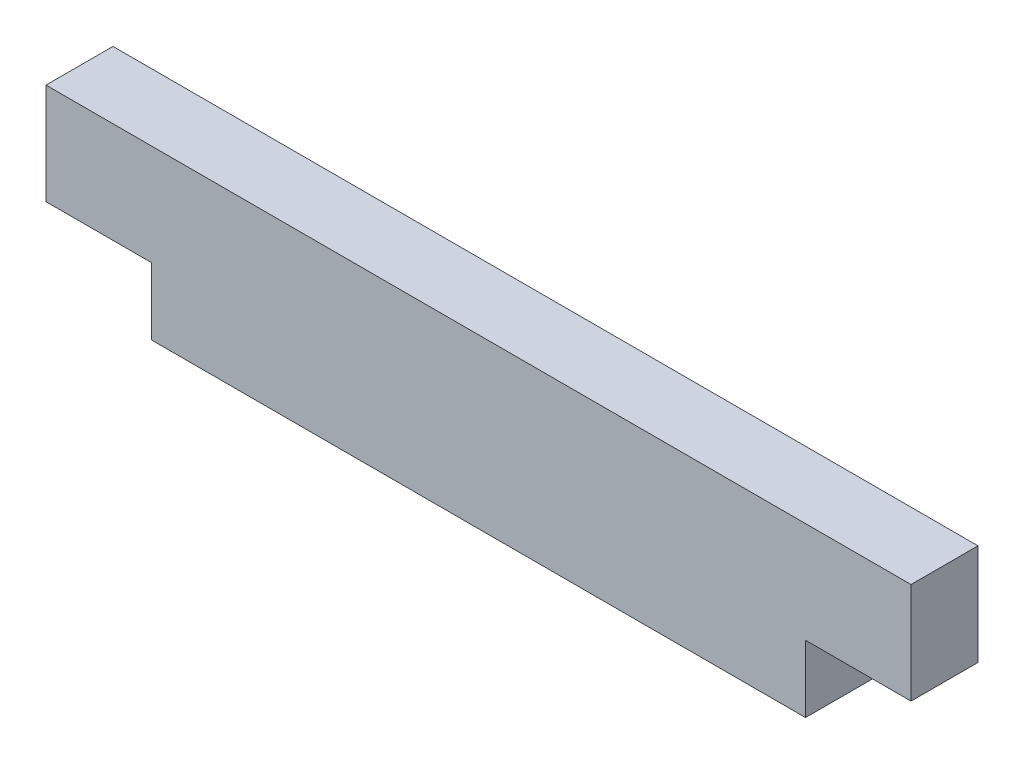
ISO-10303-21;
HEADER;
FILE_DESCRIPTION(('STEP AP214'),'2;1');
FILE_NAME('part.step','',(''),(''),'','','');
FILE_SCHEMA(('AUTOMOTIVE_DESIGN { 1 0 10303 214 1 1 1 1 }'));
ENDSEC;
DATA;
#1=APPLICATION_CONTEXT('core data for automotive mechanical design processes');
#2=APPLICATION_PROTOCOL_DEFINITION('international standard','automotive_design',2000,#1);
#3=PRODUCT_CONTEXT('',#1,'mechanical');
#4=PRODUCT('Part','Part','',(#3));
#5=PRODUCT_RELATED_PRODUCT_CATEGORY('part','',(#4));
#6=PRODUCT_DEFINITION_FORMATION('','',#4);
#7=PRODUCT_DEFINITION_CONTEXT('part definition',#1,'design');
#8=PRODUCT_DEFINITION('design','',#6,#7);
#9=PRODUCT_DEFINITION_SHAPE('','',#8);
#10=(LENGTH_UNIT() NAMED_UNIT(*) SI_UNIT(.MILLI.,.METRE.));
#11=(NAMED_UNIT(*) PLANE_ANGLE_UNIT() SI_UNIT($,.RADIAN.));
#12=(NAMED_UNIT(*) SI_UNIT($,.STERADIAN.) SOLID_ANGLE_UNIT());
#13=UNCERTAINTY_MEASURE_WITH_UNIT(LENGTH_MEASURE(1.E-05),#10,'distance_accuracy_value','');
#14=(GEOMETRIC_REPRESENTATION_CONTEXT(3) GLOBAL_UNCERTAINTY_ASSIGNED_CONTEXT((#13)) GLOBAL_UNIT_ASSIGNED_CONTEXT((#10,
#11,#12)) REPRESENTATION_CONTEXT('',''));
#15=CARTESIAN_POINT('',(0.,0.,0.));
#16=DIRECTION('',(0.,0.,1.));
#17=DIRECTION('',(1.,0.,0.));
#18=AXIS2_PLACEMENT_3D('',#15,#16,#17);
#19=CARTESIAN_POINT('',(0.,-2.394,3.175));
#20=DIRECTION('',(0.,1.,0.));
#21=DIRECTION('',(0.,0.,1.));
#22=AXIS2_PLACEMENT_3D('',#19,#20,#21);
#23=PLANE('',#22);
#24=DIRECTION('',(1.,0.,0.));
#25=VECTOR('',#24,1.);
#26=CARTESIAN_POINT('',(0.,-2.394,0.));
#27=LINE('',#26,#25);
#28=CARTESIAN_POINT('',(-20.5,-2.394,0.));
#29=VERTEX_POINT('',#28);
#30=CARTESIAN_POINT('',(-15.5,-2.394,0.));
#31=VERTEX_POINT('',#30);
#32=EDGE_CURVE('E149',#29,#31,#27,.T.);
#33=ORIENTED_EDGE('',*,*,#32,.T.);
#34=DIRECTION('',(0.,0.,-1.));
#35=VECTOR('',#34,1.);
#36=CARTESIAN_POINT('',(-15.5,-2.394,3.175));
#37=LINE('',#36,#35);
#38=CARTESIAN_POINT('',(-15.5,-2.394,3.175));
#39=VERTEX_POINT('',#38);
#40=EDGE_CURVE('E11',#39,#31,#37,.T.);
#41=ORIENTED_EDGE('',*,*,#40,.F.);
#42=DIRECTION('',(1.,0.,0.));
#43=VECTOR('',#42,1.);
#44=CARTESIAN_POINT('',(0.,-2.394,3.175));
#45=LINE('',#44,#43);
#46=CARTESIAN_POINT('',(-20.5,-2.394,3.175));
#47=VERTEX_POINT('',#46);
#48=EDGE_CURVE('E174',#47,#39,#45,.T.);
#49=ORIENTED_EDGE('',*,*,#48,.F.);
#50=DIRECTION('',(0.,0.,-1.));
#51=VECTOR('',#50,1.);
#52=CARTESIAN_POINT('',(-20.5,-2.394,3.175));
#53=LINE('',#52,#51);
#54=EDGE_CURVE('E63',#47,#29,#53,.T.);
#55=ORIENTED_EDGE('',*,*,#54,.T.);
#56=EDGE_LOOP('',(#33,#41,#49,#55));
#57=FACE_BOUND('',#56,.T.);
#58=ADVANCED_FACE('F45',(#57),#23,.F.);
#59=CARTESIAN_POINT('',(-15.5,0.,3.175));
#60=DIRECTION('',(1.,0.,0.));
#61=DIRECTION('',(0.,0.,-1.));
#62=AXIS2_PLACEMENT_3D('',#59,#60,#61);
#63=PLANE('',#62);
#64=DIRECTION('',(0.,-1.,0.));
#65=VECTOR('',#64,1.);
#66=CARTESIAN_POINT('',(-15.5,0.,0.));
#67=LINE('',#66,#65);
#68=CARTESIAN_POINT('',(-15.5,-5.569,0.));
#69=VERTEX_POINT('',#68);
#70=EDGE_CURVE('E152',#31,#69,#67,.T.);
#71=ORIENTED_EDGE('',*,*,#70,.T.);
#72=DIRECTION('',(0.,0.,-1.));
#73=VECTOR('',#72,1.);
#74=CARTESIAN_POINT('',(-15.5,-5.569,3.175));
#75=LINE('',#74,#73);
#76=CARTESIAN_POINT('',(-15.5,-5.569,3.175));
#77=VERTEX_POINT('',#76);
#78=EDGE_CURVE('E55',#77,#69,#75,.T.);
#79=ORIENTED_EDGE('',*,*,#78,.F.);
#80=DIRECTION('',(0.,-1.,0.));
#81=VECTOR('',#80,1.);
#82=CARTESIAN_POINT('',(-15.5,0.,3.175));
#83=LINE('',#82,#81);
#84=EDGE_CURVE('E101',#39,#77,#83,.T.);
#85=ORIENTED_EDGE('',*,*,#84,.F.);
#86=ORIENTED_EDGE('',*,*,#40,.T.);
#87=EDGE_LOOP('',(#71,#79,#85,#86));
#88=FACE_BOUND('',#87,.T.);
#89=ADVANCED_FACE('F47',(#88),#63,.F.);
#90=CARTESIAN_POINT('',(0.,-5.569,3.175));
#91=DIRECTION('',(0.,1.,0.));
#92=DIRECTION('',(0.,0.,1.));
#93=AXIS2_PLACEMENT_3D('',#90,#91,#92);
#94=PLANE('',#93);
#95=DIRECTION('',(1.,0.,0.));
#96=VECTOR('',#95,1.);
#97=CARTESIAN_POINT('',(0.,-5.569,0.));
#98=LINE('',#97,#96);
#99=CARTESIAN_POINT('',(15.5,-5.569,0.));
#100=VERTEX_POINT('',#99);
#101=EDGE_CURVE('E157',#69,#100,#98,.T.);
#102=ORIENTED_EDGE('',*,*,#101,.T.);
#103=DIRECTION('',(0.,0.,-1.));
#104=VECTOR('',#103,1.);
#105=CARTESIAN_POINT('',(15.5,-5.569,3.175));
#106=LINE('',#105,#104);
#107=CARTESIAN_POINT('',(15.5,-5.569,3.175));
#108=VERTEX_POINT('',#107);
#109=EDGE_CURVE('E184',#108,#100,#106,.T.);
#110=ORIENTED_EDGE('',*,*,#109,.F.);
#111=DIRECTION('',(1.,0.,0.));
#112=VECTOR('',#111,1.);
#113=CARTESIAN_POINT('',(0.,-5.569,3.175));
#114=LINE('',#113,#112);
#115=EDGE_CURVE('E192',#77,#108,#114,.T.);
#116=ORIENTED_EDGE('',*,*,#115,.F.);
#117=ORIENTED_EDGE('',*,*,#78,.T.);
#118=EDGE_LOOP('',(#102,#110,#116,#117));
#119=FACE_BOUND('',#118,.T.);
#120=ADVANCED_FACE('F190',(#119),#94,.F.);
#121=CARTESIAN_POINT('',(15.5,0.,3.175));
#122=DIRECTION('',(1.,0.,0.));
#123=DIRECTION('',(0.,0.,-1.));
#124=AXIS2_PLACEMENT_3D('',#121,#122,#123);
#125=PLANE('',#124);
#126=DIRECTION('',(0.,-1.,0.));
#127=VECTOR('',#126,1.);
#128=CARTESIAN_POINT('',(15.5,0.,0.));
#129=LINE('',#128,#127);
#130=CARTESIAN_POINT('',(15.5,-2.394,0.));
#131=VERTEX_POINT('',#130);
#132=EDGE_CURVE('E161',#131,#100,#129,.T.);
#133=ORIENTED_EDGE('',*,*,#132,.F.);
#134=DIRECTION('',(0.,0.,-1.));
#135=VECTOR('',#134,1.);
#136=CARTESIAN_POINT('',(15.5,-2.394,3.175));
#137=LINE('',#136,#135);
#138=CARTESIAN_POINT('',(15.5,-2.394,3.175));
#139=VERTEX_POINT('',#138);
#140=EDGE_CURVE('E181',#139,#131,#137,.T.);
#141=ORIENTED_EDGE('',*,*,#140,.F.);
#142=DIRECTION('',(0.,-1.,0.));
#143=VECTOR('',#142,1.);
#144=CARTESIAN_POINT('',(15.5,0.,3.175));
#145=LINE('',#144,#143);
#146=EDGE_CURVE('E201',#139,#108,#145,.T.);
#147=ORIENTED_EDGE('',*,*,#146,.T.);
#148=ORIENTED_EDGE('',*,*,#109,.T.);
#149=EDGE_LOOP('',(#133,#141,#147,#148));
#150=FACE_BOUND('',#149,.T.);
#151=ADVANCED_FACE('F199',(#150),#125,.T.);
#152=CARTESIAN_POINT('',(20.5,-2.394,0.));
#153=VERTEX_POINT('',#152);
#154=EDGE_CURVE('E153',#131,#153,#27,.T.);
#155=ORIENTED_EDGE('',*,*,#154,.T.);
#156=DIRECTION('',(0.,0.,-1.));
#157=VECTOR('',#156,1.);
#158=CARTESIAN_POINT('',(20.5,-2.394,3.175));
#159=LINE('',#158,#157);
#160=CARTESIAN_POINT('',(20.5,-2.394,3.175));
#161=VERTEX_POINT('',#160);
#162=EDGE_CURVE('E139',#161,#153,#159,.T.);
#163=ORIENTED_EDGE('',*,*,#162,.F.);
#164=EDGE_CURVE('E125',#139,#161,#45,.T.);
#165=ORIENTED_EDGE('',*,*,#164,.F.);
#166=ORIENTED_EDGE('',*,*,#140,.T.);
#167=EDGE_LOOP('',(#155,#163,#165,#166));
#168=FACE_BOUND('',#167,.T.);
#169=ADVANCED_FACE('F212',(#168),#23,.F.);
#170=CARTESIAN_POINT('',(20.5,0.,3.175));
#171=DIRECTION('',(-1.,0.,0.));
#172=DIRECTION('',(0.,0.,1.));
#173=AXIS2_PLACEMENT_3D('',#170,#171,#172);
#174=PLANE('',#173);
#175=DIRECTION('',(0.,1.,0.));
#176=VECTOR('',#175,1.);
#177=CARTESIAN_POINT('',(20.5,0.,0.));
#178=LINE('',#177,#176);
#179=CARTESIAN_POINT('',(20.5,2.394,0.));
#180=VERTEX_POINT('',#179);
#181=EDGE_CURVE('E135',#153,#180,#178,.T.);
#182=ORIENTED_EDGE('',*,*,#181,.T.);
#183=DIRECTION('',(0.,0.,-1.));
#184=VECTOR('',#183,1.);
#185=CARTESIAN_POINT('',(20.5,2.394,3.175));
#186=LINE('',#185,#184);
#187=CARTESIAN_POINT('',(20.5,2.394,3.175));
#188=VERTEX_POINT('',#187);
#189=EDGE_CURVE('E132',#188,#180,#186,.T.);
#190=ORIENTED_EDGE('',*,*,#189,.F.);
#191=DIRECTION('',(0.,1.,0.));
#192=VECTOR('',#191,1.);
#193=CARTESIAN_POINT('',(20.5,0.,3.175));
#194=LINE('',#193,#192);
#195=EDGE_CURVE('E117',#161,#188,#194,.T.);
#196=ORIENTED_EDGE('',*,*,#195,.F.);
#197=ORIENTED_EDGE('',*,*,#162,.T.);
#198=EDGE_LOOP('',(#182,#190,#196,#197));
#199=FACE_BOUND('',#198,.T.);
#200=ADVANCED_FACE('F133',(#199),#174,.F.);
#201=CARTESIAN_POINT('',(0.,2.394,3.175));
#202=DIRECTION('',(0.,1.,0.));
#203=DIRECTION('',(0.,0.,1.));
#204=AXIS2_PLACEMENT_3D('',#201,#202,#203);
#205=PLANE('',#204);
#206=DIRECTION('',(1.,0.,0.));
#207=VECTOR('',#206,1.);
#208=CARTESIAN_POINT('',(0.,2.394,0.));
#209=LINE('',#208,#207);
#210=CARTESIAN_POINT('',(-20.5,2.394,0.));
#211=VERTEX_POINT('',#210);
#212=EDGE_CURVE('E167',#211,#180,#209,.T.);
#213=ORIENTED_EDGE('',*,*,#212,.F.);
#214=DIRECTION('',(0.,0.,-1.));
#215=VECTOR('',#214,1.);
#216=CARTESIAN_POINT('',(-20.5,2.394,3.175));
#217=LINE('',#216,#215);
#218=CARTESIAN_POINT('',(-20.5,2.394,3.175));
#219=VERTEX_POINT('',#218);
#220=EDGE_CURVE('E89',#219,#211,#217,.T.);
#221=ORIENTED_EDGE('',*,*,#220,.F.);
#222=DIRECTION('',(1.,0.,0.));
#223=VECTOR('',#222,1.);
#224=CARTESIAN_POINT('',(0.,2.394,3.175));
#225=LINE('',#224,#223);
#226=EDGE_CURVE('E122',#219,#188,#225,.T.);
#227=ORIENTED_EDGE('',*,*,#226,.T.);
#228=ORIENTED_EDGE('',*,*,#189,.T.);
#229=EDGE_LOOP('',(#213,#221,#227,#228));
#230=FACE_BOUND('',#229,.T.);
#231=ADVANCED_FACE('F141',(#230),#205,.T.);
#232=CARTESIAN_POINT('',(-20.5,0.,3.175));
#233=DIRECTION('',(-1.,0.,0.));
#234=DIRECTION('',(0.,0.,1.));
#235=AXIS2_PLACEMENT_3D('',#232,#233,#234);
#236=PLANE('',#235);
#237=DIRECTION('',(0.,1.,0.));
#238=VECTOR('',#237,1.);
#239=CARTESIAN_POINT('',(-20.5,0.,0.));
#240=LINE('',#239,#238);
#241=EDGE_CURVE('E170',#29,#211,#240,.T.);
#242=ORIENTED_EDGE('',*,*,#241,.F.);
#243=ORIENTED_EDGE('',*,*,#54,.F.);
#244=DIRECTION('',(0.,1.,0.));
#245=VECTOR('',#244,1.);
#246=CARTESIAN_POINT('',(-20.5,0.,3.175));
#247=LINE('',#246,#245);
#248=EDGE_CURVE('E143',#47,#219,#247,.T.);
#249=ORIENTED_EDGE('',*,*,#248,.T.);
#250=ORIENTED_EDGE('',*,*,#220,.T.);
#251=EDGE_LOOP('',(#242,#243,#249,#250));
#252=FACE_BOUND('',#251,.T.);
#253=ADVANCED_FACE('F225',(#252),#236,.T.);
#254=CARTESIAN_POINT('',(0.,0.,3.175));
#255=DIRECTION('',(0.,0.,1.));
#256=DIRECTION('',(1.,0.,0.));
#257=AXIS2_PLACEMENT_3D('',#254,#255,#256);
#258=PLANE('',#257);
#259=ORIENTED_EDGE('',*,*,#115,.T.);
#260=ORIENTED_EDGE('',*,*,#146,.F.);
#261=ORIENTED_EDGE('',*,*,#164,.T.);
#262=ORIENTED_EDGE('',*,*,#195,.T.);
#263=ORIENTED_EDGE('',*,*,#226,.F.);
#264=ORIENTED_EDGE('',*,*,#248,.F.);
#265=ORIENTED_EDGE('',*,*,#48,.T.);
#266=ORIENTED_EDGE('',*,*,#84,.T.);
#267=EDGE_LOOP('',(#259,#260,#261,#262,#263,#264,#265,#266));
#268=FACE_BOUND('',#267,.T.);
#269=ADVANCED_FACE('F119',(#268),#258,.T.);
#270=CARTESIAN_POINT('',(0.,0.,0.));
#271=DIRECTION('',(0.,0.,1.));
#272=DIRECTION('',(1.,0.,0.));
#273=AXIS2_PLACEMENT_3D('',#270,#271,#272);
#274=PLANE('',#273);
#275=ORIENTED_EDGE('',*,*,#101,.F.);
#276=ORIENTED_EDGE('',*,*,#70,.F.);
#277=ORIENTED_EDGE('',*,*,#32,.F.);
#278=ORIENTED_EDGE('',*,*,#241,.T.);
#279=ORIENTED_EDGE('',*,*,#212,.T.);
#280=ORIENTED_EDGE('',*,*,#181,.F.);
#281=ORIENTED_EDGE('',*,*,#154,.F.);
#282=ORIENTED_EDGE('',*,*,#132,.T.);
#283=EDGE_LOOP('',(#275,#276,#277,#278,#279,#280,#281,#282));
#284=FACE_BOUND('',#283,.T.);
#285=ADVANCED_FACE('F195',(#284),#274,.F.);
#286=CLOSED_SHELL('',(#58,#89,#120,#151,#169,#200,#231,#253,#269,#285));
#287=MANIFOLD_SOLID_BREP('B2',#286);
#288=ADVANCED_BREP_SHAPE_REPRESENTATION('',(#18,#287),#14);
#289=SHAPE_DEFINITION_REPRESENTATION(#9,#288);
ENDSEC;
END-ISO-10303-21;
